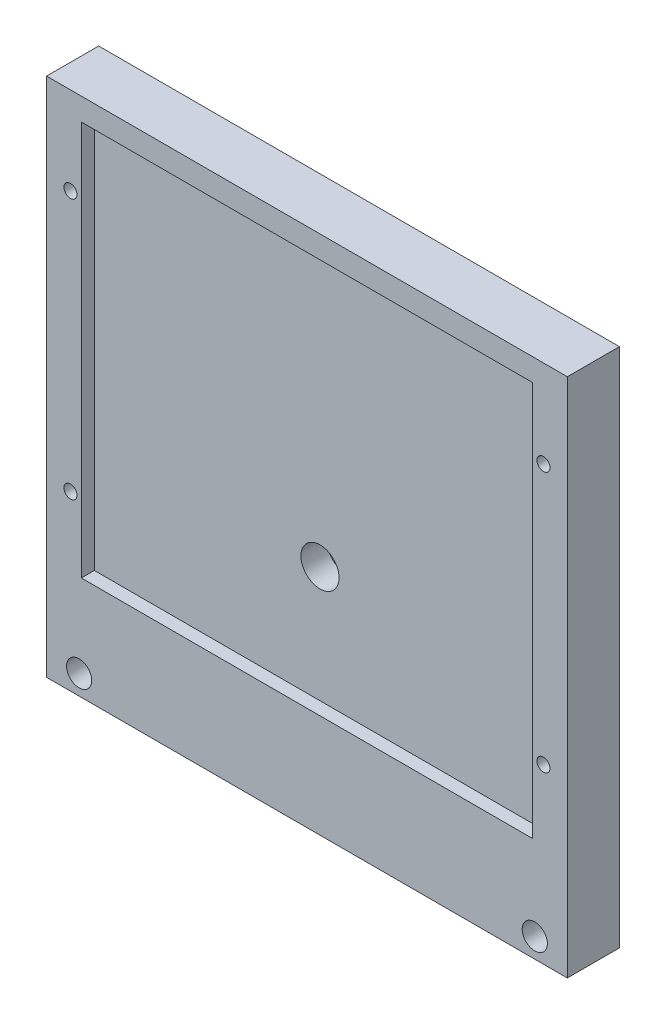
ISO-10303-21;
HEADER;
FILE_DESCRIPTION(('STEP AP214'),'2;1');
FILE_NAME('part.step','',(''),(''),'','','');
FILE_SCHEMA(('AUTOMOTIVE_DESIGN { 1 0 10303 214 1 1 1 1 }'));
ENDSEC;
DATA;
#1=APPLICATION_CONTEXT('core data for automotive mechanical design processes');
#2=APPLICATION_PROTOCOL_DEFINITION('international standard','automotive_design',2000,#1);
#3=PRODUCT_CONTEXT('',#1,'mechanical');
#4=PRODUCT('Part','Part','',(#3));
#5=PRODUCT_RELATED_PRODUCT_CATEGORY('part','',(#4));
#6=PRODUCT_DEFINITION_FORMATION('','',#4);
#7=PRODUCT_DEFINITION_CONTEXT('part definition',#1,'design');
#8=PRODUCT_DEFINITION('design','',#6,#7);
#9=PRODUCT_DEFINITION_SHAPE('','',#8);
#10=(LENGTH_UNIT() NAMED_UNIT(*) SI_UNIT(.MILLI.,.METRE.));
#11=(NAMED_UNIT(*) PLANE_ANGLE_UNIT() SI_UNIT($,.RADIAN.));
#12=(NAMED_UNIT(*) SI_UNIT($,.STERADIAN.) SOLID_ANGLE_UNIT());
#13=UNCERTAINTY_MEASURE_WITH_UNIT(LENGTH_MEASURE(1.E-05),#10,'distance_accuracy_value','');
#14=(GEOMETRIC_REPRESENTATION_CONTEXT(3) GLOBAL_UNCERTAINTY_ASSIGNED_CONTEXT((#13)) GLOBAL_UNIT_ASSIGNED_CONTEXT((#10,
#11,#12)) REPRESENTATION_CONTEXT('',''));
#15=CARTESIAN_POINT('',(0.,0.,0.));
#16=DIRECTION('',(0.,0.,1.));
#17=DIRECTION('',(1.,0.,0.));
#18=AXIS2_PLACEMENT_3D('',#15,#16,#17);
#19=CARTESIAN_POINT('',(-10.2439024390243,-7.42403473005044,0.));
#20=DIRECTION('',(0.,0.,1.));
#21=DIRECTION('',(1.,0.,0.));
#22=AXIS2_PLACEMENT_3D('',#19,#20,#21);
#23=CYLINDRICAL_SURFACE('',#22,2.25);
#24=CARTESIAN_POINT('',(-10.2439024390243,-7.42403473005044,0.));
#25=DIRECTION('',(0.,0.,1.));
#26=DIRECTION('',(1.,0.,0.));
#27=AXIS2_PLACEMENT_3D('',#24,#25,#26);
#28=CIRCLE('',#27,2.25);
#29=CARTESIAN_POINT('',(-7.99390243902434,-7.42403473005044,0.));
#30=VERTEX_POINT('',#29);
#31=EDGE_CURVE('E143',#30,#30,#28,.T.);
#32=ORIENTED_EDGE('',*,*,#31,.F.);
#33=EDGE_LOOP('',(#32));
#34=FACE_BOUND('',#33,.T.);
#35=CARTESIAN_POINT('',(-10.2439024390243,-7.42403473005044,3.));
#36=DIRECTION('',(0.,0.,1.));
#37=DIRECTION('',(1.,0.,0.));
#38=AXIS2_PLACEMENT_3D('',#35,#36,#37);
#39=CIRCLE('',#38,2.25);
#40=CARTESIAN_POINT('',(-7.99390243902434,-7.42403473005044,3.));
#41=VERTEX_POINT('',#40);
#42=EDGE_CURVE('E184',#41,#41,#39,.F.);
#43=ORIENTED_EDGE('',*,*,#42,.F.);
#44=EDGE_LOOP('',(#43));
#45=FACE_BOUND('',#44,.T.);
#46=ADVANCED_FACE('F41',(#34,#45),#23,.F.);
#47=CARTESIAN_POINT('',(42.2560975609757,-53.4240347300504,0.));
#48=DIRECTION('',(0.,0.,1.));
#49=DIRECTION('',(1.,0.,0.));
#50=AXIS2_PLACEMENT_3D('',#47,#48,#49);
#51=CYLINDRICAL_SURFACE('',#50,1.75);
#52=CARTESIAN_POINT('',(42.2560975609757,-53.4240347300504,0.));
#53=DIRECTION('',(0.,0.,1.));
#54=DIRECTION('',(1.,0.,0.));
#55=AXIS2_PLACEMENT_3D('',#52,#53,#54);
#56=CIRCLE('',#55,1.75);
#57=CARTESIAN_POINT('',(44.0060975609757,-53.4240347300504,0.));
#58=VERTEX_POINT('',#57);
#59=EDGE_CURVE('E189',#58,#58,#56,.T.);
#60=ORIENTED_EDGE('',*,*,#59,.F.);
#61=EDGE_LOOP('',(#60));
#62=FACE_BOUND('',#61,.T.);
#63=CARTESIAN_POINT('',(42.2560975609757,-53.4240347300504,3.));
#64=DIRECTION('',(0.,0.,1.));
#65=DIRECTION('',(1.,0.,0.));
#66=AXIS2_PLACEMENT_3D('',#63,#64,#65);
#67=CIRCLE('',#66,1.75);
#68=CARTESIAN_POINT('',(44.0060975609757,-53.4240347300504,3.));
#69=VERTEX_POINT('',#68);
#70=EDGE_CURVE('E181',#69,#69,#67,.F.);
#71=ORIENTED_EDGE('',*,*,#70,.F.);
#72=EDGE_LOOP('',(#71));
#73=FACE_BOUND('',#72,.T.);
#74=ADVANCED_FACE('F277',(#62,#73),#51,.F.);
#75=CARTESIAN_POINT('',(-62.7439024390243,-53.4240347300504,0.));
#76=DIRECTION('',(0.,0.,1.));
#77=DIRECTION('',(1.,0.,0.));
#78=AXIS2_PLACEMENT_3D('',#75,#76,#77);
#79=CYLINDRICAL_SURFACE('',#78,1.75);
#80=CARTESIAN_POINT('',(-62.7439024390243,-53.4240347300504,0.));
#81=DIRECTION('',(0.,0.,1.));
#82=DIRECTION('',(1.,0.,0.));
#83=AXIS2_PLACEMENT_3D('',#80,#81,#82);
#84=CIRCLE('',#83,1.75);
#85=CARTESIAN_POINT('',(-60.9939024390243,-53.4240347300504,0.));
#86=VERTEX_POINT('',#85);
#87=EDGE_CURVE('E193',#86,#86,#84,.T.);
#88=ORIENTED_EDGE('',*,*,#87,.F.);
#89=EDGE_LOOP('',(#88));
#90=FACE_BOUND('',#89,.T.);
#91=CARTESIAN_POINT('',(-62.7439024390243,-53.4240347300504,3.));
#92=DIRECTION('',(0.,0.,1.));
#93=DIRECTION('',(1.,0.,0.));
#94=AXIS2_PLACEMENT_3D('',#91,#92,#93);
#95=CIRCLE('',#94,1.75);
#96=CARTESIAN_POINT('',(-60.9939024390243,-53.4240347300504,3.));
#97=VERTEX_POINT('',#96);
#98=EDGE_CURVE('E178',#97,#97,#95,.F.);
#99=ORIENTED_EDGE('',*,*,#98,.F.);
#100=EDGE_LOOP('',(#99));
#101=FACE_BOUND('',#100,.T.);
#102=ADVANCED_FACE('F284',(#90,#101),#79,.F.);
#103=CARTESIAN_POINT('',(-70.2439024390243,62.0262664165103,12.));
#104=DIRECTION('',(1.,0.,0.));
#105=DIRECTION('',(0.,1.,0.));
#106=AXIS2_PLACEMENT_3D('',#103,#104,#105);
#107=PLANE('',#106);
#108=DIRECTION('',(0.,-1.,0.));
#109=VECTOR('',#108,1.);
#110=CARTESIAN_POINT('',(-70.2439024390243,62.0262664165103,0.));
#111=LINE('',#110,#109);
#112=CARTESIAN_POINT('',(-70.2439024390243,62.0262664165103,0.));
#113=VERTEX_POINT('',#112);
#114=CARTESIAN_POINT('',(-70.2439024390243,-57.9737335834897,0.));
#115=VERTEX_POINT('',#114);
#116=EDGE_CURVE('E155',#113,#115,#111,.T.);
#117=ORIENTED_EDGE('',*,*,#116,.T.);
#118=DIRECTION('',(0.,0.,-1.));
#119=VECTOR('',#118,1.);
#120=CARTESIAN_POINT('',(-70.2439024390243,-57.9737335834897,12.));
#121=LINE('',#120,#119);
#122=CARTESIAN_POINT('',(-70.2439024390243,-57.9737335834897,12.));
#123=VERTEX_POINT('',#122);
#124=EDGE_CURVE('E11',#123,#115,#121,.T.);
#125=ORIENTED_EDGE('',*,*,#124,.F.);
#126=DIRECTION('',(0.,-1.,0.));
#127=VECTOR('',#126,1.);
#128=CARTESIAN_POINT('',(-70.2439024390243,62.0262664165103,12.));
#129=LINE('',#128,#127);
#130=CARTESIAN_POINT('',(-70.2439024390243,62.0262664165103,12.));
#131=VERTEX_POINT('',#130);
#132=EDGE_CURVE('E159',#131,#123,#129,.T.);
#133=ORIENTED_EDGE('',*,*,#132,.F.);
#134=DIRECTION('',(0.,0.,-1.));
#135=VECTOR('',#134,1.);
#136=CARTESIAN_POINT('',(-70.2439024390243,62.0262664165103,12.));
#137=LINE('',#136,#135);
#138=EDGE_CURVE('E165',#131,#113,#137,.T.);
#139=ORIENTED_EDGE('',*,*,#138,.T.);
#140=EDGE_LOOP('',(#117,#125,#133,#139));
#141=FACE_BOUND('',#140,.T.);
#142=ADVANCED_FACE('F43',(#141),#107,.F.);
#143=CARTESIAN_POINT('',(-70.2439024390243,-57.9737335834897,12.));
#144=DIRECTION('',(0.,1.,0.));
#145=DIRECTION('',(0.,0.,1.));
#146=AXIS2_PLACEMENT_3D('',#143,#144,#145);
#147=PLANE('',#146);
#148=DIRECTION('',(1.,0.,0.));
#149=VECTOR('',#148,1.);
#150=CARTESIAN_POINT('',(-70.2439024390243,-57.9737335834897,0.));
#151=LINE('',#150,#149);
#152=CARTESIAN_POINT('',(49.7560975609757,-57.9737335834897,0.));
#153=VERTEX_POINT('',#152);
#154=EDGE_CURVE('E168',#115,#153,#151,.T.);
#155=ORIENTED_EDGE('',*,*,#154,.T.);
#156=DIRECTION('',(0.,0.,-1.));
#157=VECTOR('',#156,1.);
#158=CARTESIAN_POINT('',(49.7560975609757,-57.9737335834897,12.));
#159=LINE('',#158,#157);
#160=CARTESIAN_POINT('',(49.7560975609757,-57.9737335834897,12.));
#161=VERTEX_POINT('',#160);
#162=EDGE_CURVE('E50',#161,#153,#159,.T.);
#163=ORIENTED_EDGE('',*,*,#162,.F.);
#164=DIRECTION('',(1.,0.,0.));
#165=VECTOR('',#164,1.);
#166=CARTESIAN_POINT('',(-70.2439024390243,-57.9737335834897,12.));
#167=LINE('',#166,#165);
#168=EDGE_CURVE('E95',#123,#161,#167,.T.);
#169=ORIENTED_EDGE('',*,*,#168,.F.);
#170=ORIENTED_EDGE('',*,*,#124,.T.);
#171=EDGE_LOOP('',(#155,#163,#169,#170));
#172=FACE_BOUND('',#171,.T.);
#173=ADVANCED_FACE('F258',(#172),#147,.F.);
#174=CARTESIAN_POINT('',(49.7560975609756,62.0262664165103,12.));
#175=DIRECTION('',(-1.,0.,0.));
#176=DIRECTION('',(0.,-1.,0.));
#177=AXIS2_PLACEMENT_3D('',#174,#175,#176);
#178=PLANE('',#177);
#179=DIRECTION('',(0.,1.,0.));
#180=VECTOR('',#179,1.);
#181=CARTESIAN_POINT('',(49.7560975609756,62.0262664165103,0.));
#182=LINE('',#181,#180);
#183=CARTESIAN_POINT('',(49.7560975609756,62.0262664165103,0.));
#184=VERTEX_POINT('',#183);
#185=EDGE_CURVE('E170',#153,#184,#182,.T.);
#186=ORIENTED_EDGE('',*,*,#185,.T.);
#187=DIRECTION('',(0.,0.,-1.));
#188=VECTOR('',#187,1.);
#189=CARTESIAN_POINT('',(49.7560975609756,62.0262664165103,12.));
#190=LINE('',#189,#188);
#191=CARTESIAN_POINT('',(49.7560975609756,62.0262664165103,12.));
#192=VERTEX_POINT('',#191);
#193=EDGE_CURVE('E174',#192,#184,#190,.T.);
#194=ORIENTED_EDGE('',*,*,#193,.F.);
#195=DIRECTION('',(0.,1.,0.));
#196=VECTOR('',#195,1.);
#197=CARTESIAN_POINT('',(49.7560975609756,62.0262664165103,12.));
#198=LINE('',#197,#196);
#199=EDGE_CURVE('E162',#161,#192,#198,.T.);
#200=ORIENTED_EDGE('',*,*,#199,.F.);
#201=ORIENTED_EDGE('',*,*,#162,.T.);
#202=EDGE_LOOP('',(#186,#194,#200,#201));
#203=FACE_BOUND('',#202,.T.);
#204=ADVANCED_FACE('F263',(#203),#178,.F.);
#205=CARTESIAN_POINT('',(-70.2439024390243,62.0262664165103,12.));
#206=DIRECTION('',(0.,-1.,0.));
#207=DIRECTION('',(0.,0.,-1.));
#208=AXIS2_PLACEMENT_3D('',#205,#206,#207);
#209=PLANE('',#208);
#210=DIRECTION('',(-1.,0.,0.));
#211=VECTOR('',#210,1.);
#212=CARTESIAN_POINT('',(-70.2439024390243,62.0262664165103,0.));
#213=LINE('',#212,#211);
#214=EDGE_CURVE('E88',#184,#113,#213,.T.);
#215=ORIENTED_EDGE('',*,*,#214,.T.);
#216=ORIENTED_EDGE('',*,*,#138,.F.);
#217=DIRECTION('',(-1.,0.,0.));
#218=VECTOR('',#217,1.);
#219=CARTESIAN_POINT('',(-70.2439024390243,62.0262664165103,12.));
#220=LINE('',#219,#218);
#221=EDGE_CURVE('E67',#192,#131,#220,.T.);
#222=ORIENTED_EDGE('',*,*,#221,.F.);
#223=ORIENTED_EDGE('',*,*,#193,.T.);
#224=EDGE_LOOP('',(#215,#216,#222,#223));
#225=FACE_BOUND('',#224,.T.);
#226=ADVANCED_FACE('F244',(#225),#209,.F.);
#227=CARTESIAN_POINT('',(0.,0.,12.));
#228=DIRECTION('',(0.,0.,1.));
#229=DIRECTION('',(1.,0.,0.));
#230=AXIS2_PLACEMENT_3D('',#227,#228,#229);
#231=PLANE('',#230);
#232=CARTESIAN_POINT('',(44.2560975609757,-18.139351481589,12.));
#233=DIRECTION('',(0.,0.,1.));
#234=DIRECTION('',(1.,0.,0.));
#235=AXIS2_PLACEMENT_3D('',#232,#233,#234);
#236=CIRCLE('',#235,1.5);
#237=CARTESIAN_POINT('',(45.7560975609757,-18.139351481589,12.));
#238=VERTEX_POINT('',#237);
#239=EDGE_CURVE('E223',#238,#238,#236,.T.);
#240=ORIENTED_EDGE('',*,*,#239,.F.);
#241=EDGE_LOOP('',(#240));
#242=FACE_BOUND('',#241,.T.);
#243=CARTESIAN_POINT('',(44.2560975609757,41.860648518411,12.));
#244=DIRECTION('',(0.,0.,1.));
#245=DIRECTION('',(1.,0.,0.));
#246=AXIS2_PLACEMENT_3D('',#243,#244,#245);
#247=CIRCLE('',#246,1.5);
#248=CARTESIAN_POINT('',(45.7560975609757,41.860648518411,12.));
#249=VERTEX_POINT('',#248);
#250=EDGE_CURVE('E229',#249,#249,#247,.T.);
#251=ORIENTED_EDGE('',*,*,#250,.F.);
#252=EDGE_LOOP('',(#251));
#253=FACE_BOUND('',#252,.T.);
#254=CARTESIAN_POINT('',(-64.7439024390243,41.860648518411,12.));
#255=DIRECTION('',(0.,0.,1.));
#256=DIRECTION('',(1.,0.,0.));
#257=AXIS2_PLACEMENT_3D('',#254,#255,#256);
#258=CIRCLE('',#257,1.5);
#259=CARTESIAN_POINT('',(-63.2439024390243,41.860648518411,12.));
#260=VERTEX_POINT('',#259);
#261=EDGE_CURVE('E217',#260,#260,#258,.T.);
#262=ORIENTED_EDGE('',*,*,#261,.F.);
#263=EDGE_LOOP('',(#262));
#264=FACE_BOUND('',#263,.T.);
#265=CARTESIAN_POINT('',(-64.7439024390243,-18.139351481589,12.));
#266=DIRECTION('',(0.,0.,1.));
#267=DIRECTION('',(1.,0.,0.));
#268=AXIS2_PLACEMENT_3D('',#265,#266,#267);
#269=CIRCLE('',#268,1.5);
#270=CARTESIAN_POINT('',(-63.2439024390243,-18.139351481589,12.));
#271=VERTEX_POINT('',#270);
#272=EDGE_CURVE('E214',#271,#271,#269,.T.);
#273=ORIENTED_EDGE('',*,*,#272,.F.);
#274=EDGE_LOOP('',(#273));
#275=FACE_BOUND('',#274,.T.);
#276=CARTESIAN_POINT('',(-62.7439024390243,-53.4240347300504,12.));
#277=DIRECTION('',(0.,0.,1.));
#278=DIRECTION('',(1.,0.,0.));
#279=AXIS2_PLACEMENT_3D('',#276,#277,#278);
#280=CIRCLE('',#279,2.9);
#281=CARTESIAN_POINT('',(-59.8439024390243,-53.4240347300504,12.));
#282=VERTEX_POINT('',#281);
#283=EDGE_CURVE('E209',#282,#282,#280,.T.);
#284=ORIENTED_EDGE('',*,*,#283,.F.);
#285=EDGE_LOOP('',(#284));
#286=FACE_BOUND('',#285,.T.);
#287=CARTESIAN_POINT('',(42.2560975609757,-53.4240347300504,12.));
#288=DIRECTION('',(0.,0.,1.));
#289=DIRECTION('',(1.,0.,0.));
#290=AXIS2_PLACEMENT_3D('',#287,#288,#289);
#291=CIRCLE('',#290,2.9);
#292=CARTESIAN_POINT('',(45.1560975609757,-53.4240347300504,12.));
#293=VERTEX_POINT('',#292);
#294=EDGE_CURVE('E206',#293,#293,#291,.T.);
#295=ORIENTED_EDGE('',*,*,#294,.F.);
#296=EDGE_LOOP('',(#295));
#297=FACE_BOUND('',#296,.T.);
#298=DIRECTION('',(0.,-1.,0.));
#299=VECTOR('',#298,1.);
#300=CARTESIAN_POINT('',(-62.2439024390243,56.860648518411,12.));
#301=LINE('',#300,#299);
#302=CARTESIAN_POINT('',(-62.2439024390243,56.860648518411,12.));
#303=VERTEX_POINT('',#302);
#304=CARTESIAN_POINT('',(-62.2439024390243,-34.139351481589,12.));
#305=VERTEX_POINT('',#304);
#306=EDGE_CURVE('E58',#303,#305,#301,.T.);
#307=ORIENTED_EDGE('',*,*,#306,.F.);
#308=DIRECTION('',(-1.,0.,0.));
#309=VECTOR('',#308,1.);
#310=CARTESIAN_POINT('',(-62.2439024390243,56.860648518411,12.));
#311=LINE('',#310,#309);
#312=CARTESIAN_POINT('',(41.7560975609757,56.860648518411,12.));
#313=VERTEX_POINT('',#312);
#314=EDGE_CURVE('E137',#313,#303,#311,.T.);
#315=ORIENTED_EDGE('',*,*,#314,.F.);
#316=DIRECTION('',(0.,1.,0.));
#317=VECTOR('',#316,1.);
#318=CARTESIAN_POINT('',(41.7560975609757,56.860648518411,12.));
#319=LINE('',#318,#317);
#320=CARTESIAN_POINT('',(41.7560975609757,-34.139351481589,12.));
#321=VERTEX_POINT('',#320);
#322=EDGE_CURVE('E140',#321,#313,#319,.T.);
#323=ORIENTED_EDGE('',*,*,#322,.F.);
#324=DIRECTION('',(1.,0.,0.));
#325=VECTOR('',#324,1.);
#326=CARTESIAN_POINT('',(-62.2439024390243,-34.139351481589,12.));
#327=LINE('',#326,#325);
#328=EDGE_CURVE('E149',#305,#321,#327,.T.);
#329=ORIENTED_EDGE('',*,*,#328,.F.);
#330=EDGE_LOOP('',(#307,#315,#323,#329));
#331=FACE_BOUND('',#330,.T.);
#332=ORIENTED_EDGE('',*,*,#132,.T.);
#333=ORIENTED_EDGE('',*,*,#168,.T.);
#334=ORIENTED_EDGE('',*,*,#199,.T.);
#335=ORIENTED_EDGE('',*,*,#221,.T.);
#336=EDGE_LOOP('',(#332,#333,#334,#335));
#337=FACE_BOUND('',#336,.T.);
#338=ADVANCED_FACE('F240',(#242,#253,#264,#275,#286,#297,#331,#337),#231,.T.);
#339=CARTESIAN_POINT('',(0.,0.,0.));
#340=DIRECTION('',(0.,0.,1.));
#341=DIRECTION('',(1.,0.,0.));
#342=AXIS2_PLACEMENT_3D('',#339,#340,#341);
#343=PLANE('',#342);
#344=CARTESIAN_POINT('',(44.2560975609757,-18.139351481589,0.));
#345=DIRECTION('',(0.,0.,1.));
#346=DIRECTION('',(1.,0.,0.));
#347=AXIS2_PLACEMENT_3D('',#344,#345,#346);
#348=CIRCLE('',#347,1.5);
#349=CARTESIAN_POINT('',(45.7560975609757,-18.139351481589,0.));
#350=VERTEX_POINT('',#349);
#351=EDGE_CURVE('E220',#350,#350,#348,.T.);
#352=ORIENTED_EDGE('',*,*,#351,.T.);
#353=EDGE_LOOP('',(#352));
#354=FACE_BOUND('',#353,.T.);
#355=CARTESIAN_POINT('',(44.2560975609757,41.860648518411,0.));
#356=DIRECTION('',(0.,0.,1.));
#357=DIRECTION('',(1.,0.,0.));
#358=AXIS2_PLACEMENT_3D('',#355,#356,#357);
#359=CIRCLE('',#358,1.5);
#360=CARTESIAN_POINT('',(45.7560975609757,41.860648518411,0.));
#361=VERTEX_POINT('',#360);
#362=EDGE_CURVE('E226',#361,#361,#359,.T.);
#363=ORIENTED_EDGE('',*,*,#362,.T.);
#364=EDGE_LOOP('',(#363));
#365=FACE_BOUND('',#364,.T.);
#366=CARTESIAN_POINT('',(-64.7439024390243,41.860648518411,0.));
#367=DIRECTION('',(0.,0.,1.));
#368=DIRECTION('',(1.,0.,0.));
#369=AXIS2_PLACEMENT_3D('',#366,#367,#368);
#370=CIRCLE('',#369,1.5);
#371=CARTESIAN_POINT('',(-63.2439024390243,41.860648518411,0.));
#372=VERTEX_POINT('',#371);
#373=EDGE_CURVE('E232',#372,#372,#370,.T.);
#374=ORIENTED_EDGE('',*,*,#373,.T.);
#375=EDGE_LOOP('',(#374));
#376=FACE_BOUND('',#375,.T.);
#377=CARTESIAN_POINT('',(-64.7439024390243,-18.139351481589,0.));
#378=DIRECTION('',(0.,0.,1.));
#379=DIRECTION('',(1.,0.,0.));
#380=AXIS2_PLACEMENT_3D('',#377,#378,#379);
#381=CIRCLE('',#380,1.5);
#382=CARTESIAN_POINT('',(-63.2439024390243,-18.139351481589,0.));
#383=VERTEX_POINT('',#382);
#384=EDGE_CURVE('E203',#383,#383,#381,.T.);
#385=ORIENTED_EDGE('',*,*,#384,.T.);
#386=EDGE_LOOP('',(#385));
#387=FACE_BOUND('',#386,.T.);
#388=ORIENTED_EDGE('',*,*,#87,.T.);
#389=EDGE_LOOP('',(#388));
#390=FACE_BOUND('',#389,.T.);
#391=ORIENTED_EDGE('',*,*,#59,.T.);
#392=EDGE_LOOP('',(#391));
#393=FACE_BOUND('',#392,.T.);
#394=ORIENTED_EDGE('',*,*,#31,.T.);
#395=EDGE_LOOP('',(#394));
#396=FACE_BOUND('',#395,.T.);
#397=ORIENTED_EDGE('',*,*,#116,.F.);
#398=ORIENTED_EDGE('',*,*,#214,.F.);
#399=ORIENTED_EDGE('',*,*,#185,.F.);
#400=ORIENTED_EDGE('',*,*,#154,.F.);
#401=EDGE_LOOP('',(#397,#398,#399,#400));
#402=FACE_BOUND('',#401,.T.);
#403=ADVANCED_FACE('F243',(#354,#365,#376,#387,#390,#393,#396,#402),#343,.F.);
#404=CARTESIAN_POINT('',(-62.2439024390243,56.860648518411,9.));
#405=DIRECTION('',(-1.,0.,0.));
#406=DIRECTION('',(0.,0.,1.));
#407=AXIS2_PLACEMENT_3D('',#404,#405,#406);
#408=PLANE('',#407);
#409=ORIENTED_EDGE('',*,*,#306,.T.);
#410=DIRECTION('',(0.,0.,1.));
#411=VECTOR('',#410,1.);
#412=CARTESIAN_POINT('',(-62.2439024390243,-34.139351481589,9.));
#413=LINE('',#412,#411);
#414=CARTESIAN_POINT('',(-62.2439024390243,-34.139351481589,9.));
#415=VERTEX_POINT('',#414);
#416=EDGE_CURVE('E115',#415,#305,#413,.T.);
#417=ORIENTED_EDGE('',*,*,#416,.F.);
#418=DIRECTION('',(0.,-1.,0.));
#419=VECTOR('',#418,1.);
#420=CARTESIAN_POINT('',(-62.2439024390243,56.860648518411,9.));
#421=LINE('',#420,#419);
#422=CARTESIAN_POINT('',(-62.2439024390243,56.860648518411,9.));
#423=VERTEX_POINT('',#422);
#424=EDGE_CURVE('E119',#423,#415,#421,.T.);
#425=ORIENTED_EDGE('',*,*,#424,.F.);
#426=DIRECTION('',(0.,0.,1.));
#427=VECTOR('',#426,1.);
#428=CARTESIAN_POINT('',(-62.2439024390243,56.860648518411,9.));
#429=LINE('',#428,#427);
#430=EDGE_CURVE('E153',#423,#303,#429,.T.);
#431=ORIENTED_EDGE('',*,*,#430,.T.);
#432=EDGE_LOOP('',(#409,#417,#425,#431));
#433=FACE_BOUND('',#432,.T.);
#434=ADVANCED_FACE('F117',(#433),#408,.F.);
#435=CARTESIAN_POINT('',(-62.2439024390243,56.860648518411,9.));
#436=DIRECTION('',(0.,1.,0.));
#437=DIRECTION('',(-1.,0.,0.));
#438=AXIS2_PLACEMENT_3D('',#435,#436,#437);
#439=PLANE('',#438);
#440=ORIENTED_EDGE('',*,*,#314,.T.);
#441=ORIENTED_EDGE('',*,*,#430,.F.);
#442=DIRECTION('',(-1.,0.,0.));
#443=VECTOR('',#442,1.);
#444=CARTESIAN_POINT('',(-62.2439024390243,56.860648518411,9.));
#445=LINE('',#444,#443);
#446=CARTESIAN_POINT('',(41.7560975609757,56.860648518411,9.));
#447=VERTEX_POINT('',#446);
#448=EDGE_CURVE('E125',#447,#423,#445,.T.);
#449=ORIENTED_EDGE('',*,*,#448,.F.);
#450=DIRECTION('',(0.,0.,1.));
#451=VECTOR('',#450,1.);
#452=CARTESIAN_POINT('',(41.7560975609757,56.860648518411,9.));
#453=LINE('',#452,#451);
#454=EDGE_CURVE('E156',#447,#313,#453,.T.);
#455=ORIENTED_EDGE('',*,*,#454,.T.);
#456=EDGE_LOOP('',(#440,#441,#449,#455));
#457=FACE_BOUND('',#456,.T.);
#458=ADVANCED_FACE('F272',(#457),#439,.F.);
#459=CARTESIAN_POINT('',(41.7560975609757,56.860648518411,9.));
#460=DIRECTION('',(1.,0.,0.));
#461=DIRECTION('',(0.,1.,0.));
#462=AXIS2_PLACEMENT_3D('',#459,#460,#461);
#463=PLANE('',#462);
#464=ORIENTED_EDGE('',*,*,#322,.T.);
#465=ORIENTED_EDGE('',*,*,#454,.F.);
#466=DIRECTION('',(0.,1.,0.));
#467=VECTOR('',#466,1.);
#468=CARTESIAN_POINT('',(41.7560975609757,56.860648518411,9.));
#469=LINE('',#468,#467);
#470=CARTESIAN_POINT('',(41.7560975609757,-34.139351481589,9.));
#471=VERTEX_POINT('',#470);
#472=EDGE_CURVE('E133',#471,#447,#469,.T.);
#473=ORIENTED_EDGE('',*,*,#472,.F.);
#474=DIRECTION('',(0.,0.,1.));
#475=VECTOR('',#474,1.);
#476=CARTESIAN_POINT('',(41.7560975609757,-34.139351481589,9.));
#477=LINE('',#476,#475);
#478=EDGE_CURVE('E124',#471,#321,#477,.T.);
#479=ORIENTED_EDGE('',*,*,#478,.T.);
#480=EDGE_LOOP('',(#464,#465,#473,#479));
#481=FACE_BOUND('',#480,.T.);
#482=ADVANCED_FACE('F297',(#481),#463,.F.);
#483=CARTESIAN_POINT('',(-62.2439024390243,-34.139351481589,9.));
#484=DIRECTION('',(0.,-1.,0.));
#485=DIRECTION('',(0.,0.,-1.));
#486=AXIS2_PLACEMENT_3D('',#483,#484,#485);
#487=PLANE('',#486);
#488=ORIENTED_EDGE('',*,*,#328,.T.);
#489=ORIENTED_EDGE('',*,*,#478,.F.);
#490=DIRECTION('',(1.,0.,0.));
#491=VECTOR('',#490,1.);
#492=CARTESIAN_POINT('',(-62.2439024390243,-34.139351481589,9.));
#493=LINE('',#492,#491);
#494=EDGE_CURVE('E128',#415,#471,#493,.T.);
#495=ORIENTED_EDGE('',*,*,#494,.F.);
#496=ORIENTED_EDGE('',*,*,#416,.T.);
#497=EDGE_LOOP('',(#488,#489,#495,#496));
#498=FACE_BOUND('',#497,.T.);
#499=ADVANCED_FACE('F129',(#498),#487,.F.);
#500=CARTESIAN_POINT('',(0.,0.,9.));
#501=DIRECTION('',(0.,0.,1.));
#502=DIRECTION('',(1.,0.,0.));
#503=AXIS2_PLACEMENT_3D('',#500,#501,#502);
#504=PLANE('',#503);
#505=CARTESIAN_POINT('',(-10.2439024390243,-7.42403473005044,9.));
#506=DIRECTION('',(0.,0.,1.));
#507=DIRECTION('',(1.,0.,0.));
#508=AXIS2_PLACEMENT_3D('',#505,#506,#507);
#509=CIRCLE('',#508,4.4);
#510=CARTESIAN_POINT('',(-5.84390243902434,-7.42403473005044,9.));
#511=VERTEX_POINT('',#510);
#512=EDGE_CURVE('E45',#511,#511,#509,.T.);
#513=ORIENTED_EDGE('',*,*,#512,.F.);
#514=EDGE_LOOP('',(#513));
#515=FACE_BOUND('',#514,.T.);
#516=ORIENTED_EDGE('',*,*,#424,.T.);
#517=ORIENTED_EDGE('',*,*,#494,.T.);
#518=ORIENTED_EDGE('',*,*,#472,.T.);
#519=ORIENTED_EDGE('',*,*,#448,.T.);
#520=EDGE_LOOP('',(#516,#517,#518,#519));
#521=FACE_BOUND('',#520,.T.);
#522=ADVANCED_FACE('F135',(#515,#521),#504,.T.);
#523=CARTESIAN_POINT('',(-62.7439024390243,-53.4240347300504,3.));
#524=DIRECTION('',(0.,0.,1.));
#525=DIRECTION('',(1.,0.,0.));
#526=AXIS2_PLACEMENT_3D('',#523,#524,#525);
#527=PLANE('',#526);
#528=CARTESIAN_POINT('',(-62.7439024390243,-53.4240347300504,3.));
#529=DIRECTION('',(0.,0.,1.));
#530=DIRECTION('',(1.,0.,0.));
#531=AXIS2_PLACEMENT_3D('',#528,#529,#530);
#532=CIRCLE('',#531,2.9);
#533=CARTESIAN_POINT('',(-59.8439024390243,-53.4240347300504,3.));
#534=VERTEX_POINT('',#533);
#535=EDGE_CURVE('E182',#534,#534,#532,.T.);
#536=ORIENTED_EDGE('',*,*,#535,.T.);
#537=EDGE_LOOP('',(#536));
#538=FACE_BOUND('',#537,.T.);
#539=ORIENTED_EDGE('',*,*,#98,.T.);
#540=EDGE_LOOP('',(#539));
#541=FACE_BOUND('',#540,.T.);
#542=ADVANCED_FACE('F293',(#538,#541),#527,.T.);
#543=CARTESIAN_POINT('',(-62.7439024390243,-53.4240347300504,3.));
#544=DIRECTION('',(0.,0.,1.));
#545=DIRECTION('',(1.,0.,0.));
#546=AXIS2_PLACEMENT_3D('',#543,#544,#545);
#547=CYLINDRICAL_SURFACE('',#546,2.9);
#548=ORIENTED_EDGE('',*,*,#535,.F.);
#549=EDGE_LOOP('',(#548));
#550=FACE_BOUND('',#549,.T.);
#551=ORIENTED_EDGE('',*,*,#283,.T.);
#552=EDGE_LOOP('',(#551));
#553=FACE_BOUND('',#552,.T.);
#554=ADVANCED_FACE('F392',(#550,#553),#547,.F.);
#555=CARTESIAN_POINT('',(42.2560975609757,-53.4240347300504,3.));
#556=DIRECTION('',(0.,0.,1.));
#557=DIRECTION('',(1.,0.,0.));
#558=AXIS2_PLACEMENT_3D('',#555,#556,#557);
#559=PLANE('',#558);
#560=CARTESIAN_POINT('',(42.2560975609757,-53.4240347300504,3.));
#561=DIRECTION('',(0.,0.,1.));
#562=DIRECTION('',(1.,0.,0.));
#563=AXIS2_PLACEMENT_3D('',#560,#561,#562);
#564=CIRCLE('',#563,2.9);
#565=CARTESIAN_POINT('',(45.1560975609757,-53.4240347300504,3.));
#566=VERTEX_POINT('',#565);
#567=EDGE_CURVE('E202',#566,#566,#564,.T.);
#568=ORIENTED_EDGE('',*,*,#567,.T.);
#569=EDGE_LOOP('',(#568));
#570=FACE_BOUND('',#569,.T.);
#571=ORIENTED_EDGE('',*,*,#70,.T.);
#572=EDGE_LOOP('',(#571));
#573=FACE_BOUND('',#572,.T.);
#574=ADVANCED_FACE('F401',(#570,#573),#559,.T.);
#575=CARTESIAN_POINT('',(42.2560975609757,-53.4240347300504,3.));
#576=DIRECTION('',(0.,0.,1.));
#577=DIRECTION('',(1.,0.,0.));
#578=AXIS2_PLACEMENT_3D('',#575,#576,#577);
#579=CYLINDRICAL_SURFACE('',#578,2.9);
#580=ORIENTED_EDGE('',*,*,#567,.F.);
#581=EDGE_LOOP('',(#580));
#582=FACE_BOUND('',#581,.T.);
#583=ORIENTED_EDGE('',*,*,#294,.T.);
#584=EDGE_LOOP('',(#583));
#585=FACE_BOUND('',#584,.T.);
#586=ADVANCED_FACE('F410',(#582,#585),#579,.F.);
#587=CARTESIAN_POINT('',(-10.2439024390243,-7.42403473005044,3.));
#588=DIRECTION('',(0.,0.,1.));
#589=DIRECTION('',(1.,0.,0.));
#590=AXIS2_PLACEMENT_3D('',#587,#588,#589);
#591=PLANE('',#590);
#592=CARTESIAN_POINT('',(-10.2439024390243,-7.42403473005044,3.));
#593=DIRECTION('',(0.,0.,1.));
#594=DIRECTION('',(1.,0.,0.));
#595=AXIS2_PLACEMENT_3D('',#592,#593,#594);
#596=CIRCLE('',#595,4.4);
#597=CARTESIAN_POINT('',(-5.84390243902434,-7.42403473005044,3.));
#598=VERTEX_POINT('',#597);
#599=EDGE_CURVE('E199',#598,#598,#596,.T.);
#600=ORIENTED_EDGE('',*,*,#599,.T.);
#601=EDGE_LOOP('',(#600));
#602=FACE_BOUND('',#601,.T.);
#603=ORIENTED_EDGE('',*,*,#42,.T.);
#604=EDGE_LOOP('',(#603));
#605=FACE_BOUND('',#604,.T.);
#606=ADVANCED_FACE('F419',(#602,#605),#591,.T.);
#607=CARTESIAN_POINT('',(-10.2439024390243,-7.42403473005044,3.));
#608=DIRECTION('',(0.,0.,1.));
#609=DIRECTION('',(1.,0.,0.));
#610=AXIS2_PLACEMENT_3D('',#607,#608,#609);
#611=CYLINDRICAL_SURFACE('',#610,4.4);
#612=ORIENTED_EDGE('',*,*,#512,.T.);
#613=EDGE_LOOP('',(#612));
#614=FACE_BOUND('',#613,.T.);
#615=ORIENTED_EDGE('',*,*,#599,.F.);
#616=EDGE_LOOP('',(#615));
#617=FACE_BOUND('',#616,.T.);
#618=ADVANCED_FACE('F428',(#614,#617),#611,.F.);
#619=CARTESIAN_POINT('',(-64.7439024390243,-18.139351481589,0.));
#620=DIRECTION('',(0.,0.,1.));
#621=DIRECTION('',(1.,0.,0.));
#622=AXIS2_PLACEMENT_3D('',#619,#620,#621);
#623=CYLINDRICAL_SURFACE('',#622,1.5);
#624=ORIENTED_EDGE('',*,*,#384,.F.);
#625=EDGE_LOOP('',(#624));
#626=FACE_BOUND('',#625,.T.);
#627=ORIENTED_EDGE('',*,*,#272,.T.);
#628=EDGE_LOOP('',(#627));
#629=FACE_BOUND('',#628,.T.);
#630=ADVANCED_FACE('F437',(#626,#629),#623,.F.);
#631=CARTESIAN_POINT('',(-64.7439024390243,41.860648518411,0.));
#632=DIRECTION('',(0.,0.,1.));
#633=DIRECTION('',(1.,0.,0.));
#634=AXIS2_PLACEMENT_3D('',#631,#632,#633);
#635=CYLINDRICAL_SURFACE('',#634,1.5);
#636=ORIENTED_EDGE('',*,*,#373,.F.);
#637=EDGE_LOOP('',(#636));
#638=FACE_BOUND('',#637,.T.);
#639=ORIENTED_EDGE('',*,*,#261,.T.);
#640=EDGE_LOOP('',(#639));
#641=FACE_BOUND('',#640,.T.);
#642=ADVANCED_FACE('F238',(#638,#641),#635,.F.);
#643=CARTESIAN_POINT('',(44.2560975609757,41.860648518411,0.));
#644=DIRECTION('',(0.,0.,1.));
#645=DIRECTION('',(1.,0.,0.));
#646=AXIS2_PLACEMENT_3D('',#643,#644,#645);
#647=CYLINDRICAL_SURFACE('',#646,1.5);
#648=ORIENTED_EDGE('',*,*,#362,.F.);
#649=EDGE_LOOP('',(#648));
#650=FACE_BOUND('',#649,.T.);
#651=ORIENTED_EDGE('',*,*,#250,.T.);
#652=EDGE_LOOP('',(#651));
#653=FACE_BOUND('',#652,.T.);
#654=ADVANCED_FACE('F452',(#650,#653),#647,.F.);
#655=CARTESIAN_POINT('',(44.2560975609757,-18.139351481589,0.));
#656=DIRECTION('',(0.,0.,1.));
#657=DIRECTION('',(1.,0.,0.));
#658=AXIS2_PLACEMENT_3D('',#655,#656,#657);
#659=CYLINDRICAL_SURFACE('',#658,1.5);
#660=ORIENTED_EDGE('',*,*,#351,.F.);
#661=EDGE_LOOP('',(#660));
#662=FACE_BOUND('',#661,.T.);
#663=ORIENTED_EDGE('',*,*,#239,.T.);
#664=EDGE_LOOP('',(#663));
#665=FACE_BOUND('',#664,.T.);
#666=ADVANCED_FACE('F461',(#662,#665),#659,.F.);
#667=CLOSED_SHELL('',(#46,#74,#102,#142,#173,#204,#226,#338,#403,#434,#458,#482,#499,#522,#542,
#554,#574,#586,#606,#618,#630,#642,#654,#666));
#668=MANIFOLD_SOLID_BREP('B2',#667);
#669=ADVANCED_BREP_SHAPE_REPRESENTATION('',(#18,#668),#14);
#670=SHAPE_DEFINITION_REPRESENTATION(#9,#669);
ENDSEC;
END-ISO-10303-21;
